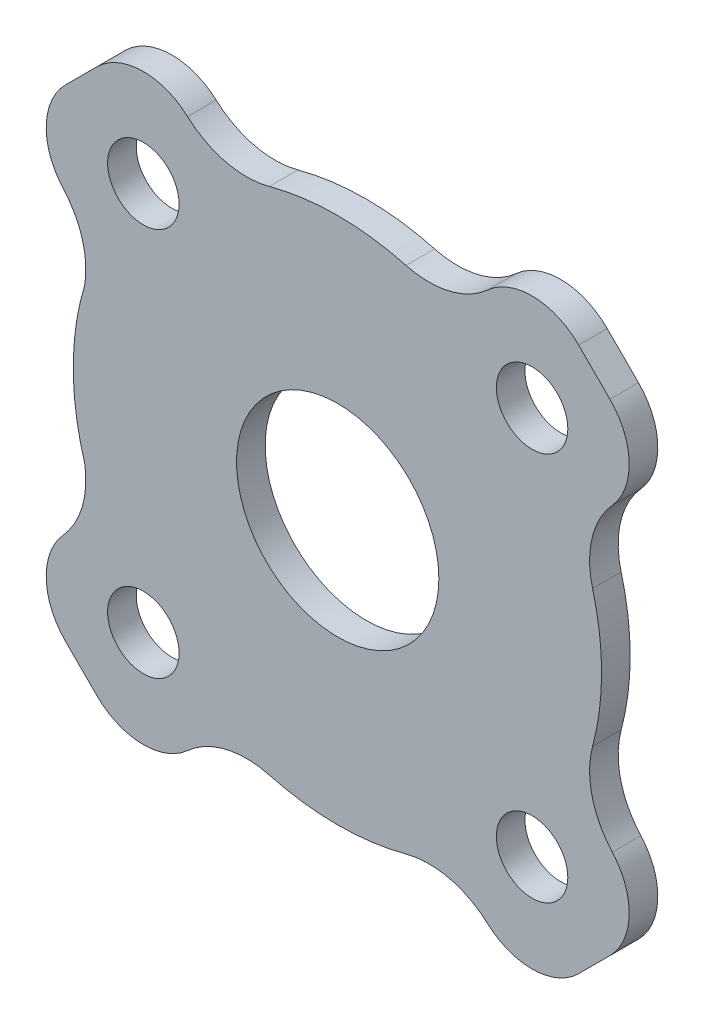
ISO-10303-21;
HEADER;
FILE_DESCRIPTION(('STEP AP214'),'2;1');
FILE_NAME('part.step','',(''),(''),'','','');
FILE_SCHEMA(('AUTOMOTIVE_DESIGN { 1 0 10303 214 1 1 1 1 }'));
ENDSEC;
DATA;
#1=APPLICATION_CONTEXT('core data for automotive mechanical design processes');
#2=APPLICATION_PROTOCOL_DEFINITION('international standard','automotive_design',2000,#1);
#3=PRODUCT_CONTEXT('',#1,'mechanical');
#4=PRODUCT('Part','Part','',(#3));
#5=PRODUCT_RELATED_PRODUCT_CATEGORY('part','',(#4));
#6=PRODUCT_DEFINITION_FORMATION('','',#4);
#7=PRODUCT_DEFINITION_CONTEXT('part definition',#1,'design');
#8=PRODUCT_DEFINITION('design','',#6,#7);
#9=PRODUCT_DEFINITION_SHAPE('','',#8);
#10=(LENGTH_UNIT() NAMED_UNIT(*) SI_UNIT(.MILLI.,.METRE.));
#11=(NAMED_UNIT(*) PLANE_ANGLE_UNIT() SI_UNIT($,.RADIAN.));
#12=(NAMED_UNIT(*) SI_UNIT($,.STERADIAN.) SOLID_ANGLE_UNIT());
#13=UNCERTAINTY_MEASURE_WITH_UNIT(LENGTH_MEASURE(1.E-05),#10,'distance_accuracy_value','');
#14=(GEOMETRIC_REPRESENTATION_CONTEXT(3) GLOBAL_UNCERTAINTY_ASSIGNED_CONTEXT((#13)) GLOBAL_UNIT_ASSIGNED_CONTEXT((#10,
#11,#12)) REPRESENTATION_CONTEXT('',''));
#15=CARTESIAN_POINT('',(0.,0.,0.));
#16=DIRECTION('',(0.,0.,1.));
#17=DIRECTION('',(1.,0.,0.));
#18=AXIS2_PLACEMENT_3D('',#15,#16,#17);
#19=CARTESIAN_POINT('',(22.4859040141901,5.93996738273083,1.3));
#20=DIRECTION('',(0.,0.,-1.));
#21=DIRECTION('',(-1.,0.,0.));
#22=AXIS2_PLACEMENT_3D('',#19,#20,#21);
#23=PLANE('',#22);
#24=CARTESIAN_POINT('',(22.4859040141901,5.93996738273083,1.3));
#25=DIRECTION('',(0.,0.,1.));
#26=DIRECTION('',(-1.,0.,0.));
#27=AXIS2_PLACEMENT_3D('',#24,#25,#26);
#28=CIRCLE('',#27,3.00000000000009);
#29=CARTESIAN_POINT('',(24.7133560858567,3.93037606397257,1.3));
#30=VERTEX_POINT('',#29);
#31=CARTESIAN_POINT('',(24.6072243577499,8.06128772629043,1.3));
#32=VERTEX_POINT('',#31);
#33=EDGE_CURVE('E291',#30,#32,#28,.T.);
#34=ORIENTED_EDGE('',*,*,#33,.T.);
#35=DIRECTION('',(-0.707106781186544,0.707106781186551,0.));
#36=VECTOR('',#35,1.);
#37=CARTESIAN_POINT('',(23.1874134986823,9.48109858535804,1.3));
#38=LINE('',#37,#36);
#39=CARTESIAN_POINT('',(23.1874134986823,9.48109858535804,1.3));
#40=VERTEX_POINT('',#39);
#41=EDGE_CURVE('E159',#32,#40,#38,.T.);
#42=ORIENTED_EDGE('',*,*,#41,.T.);
#43=CARTESIAN_POINT('',(21.0660931551227,7.35977824179842,1.3));
#44=DIRECTION('',(0.,0.,1.));
#45=DIRECTION('',(-1.,0.,0.));
#46=AXIS2_PLACEMENT_3D('',#43,#44,#45);
#47=CIRCLE('',#46,3.);
#48=CARTESIAN_POINT('',(19.0565018363651,9.58723031346558,1.3));
#49=VERTEX_POINT('',#48);
#50=EDGE_CURVE('E354',#40,#49,#47,.T.);
#51=ORIENTED_EDGE('',*,*,#50,.T.);
#52=CARTESIAN_POINT('',(16.3770467446884,12.5571664090219,1.3));
#53=DIRECTION('',(0.,0.,-1.));
#54=DIRECTION('',(-1.,0.,0.));
#55=AXIS2_PLACEMENT_3D('',#52,#53,#54);
#56=CIRCLE('',#55,4.0000000000001);
#57=CARTESIAN_POINT('',(15.3402993181757,8.69385762332792,1.3));
#58=VERTEX_POINT('',#57);
#59=EDGE_CURVE('E373',#49,#58,#56,.T.);
#60=ORIENTED_EDGE('',*,*,#59,.T.);
#61=CARTESIAN_POINT('',(12.2300570386382,-2.89606873375369,1.3));
#62=DIRECTION('',(0.,0.,1.));
#63=DIRECTION('',(-1.,0.,0.));
#64=AXIS2_PLACEMENT_3D('',#61,#62,#63);
#65=CIRCLE('',#64,11.9999999999999);
#66=CARTESIAN_POINT('',(9.11981475909832,8.69385762332731,1.3));
#67=VERTEX_POINT('',#66);
#68=EDGE_CURVE('E370',#58,#67,#65,.T.);
#69=ORIENTED_EDGE('',*,*,#68,.T.);
#70=CARTESIAN_POINT('',(8.08306733258646,12.5571664090156,1.3));
#71=DIRECTION('',(0.,0.,-1.));
#72=DIRECTION('',(-1.,0.,0.));
#73=AXIS2_PLACEMENT_3D('',#70,#71,#72);
#74=CIRCLE('',#73,3.9999999999944);
#75=CARTESIAN_POINT('',(5.40361224091216,9.58723031346477,1.3));
#76=VERTEX_POINT('',#75);
#77=EDGE_CURVE('E372',#67,#76,#74,.T.);
#78=ORIENTED_EDGE('',*,*,#77,.T.);
#79=CARTESIAN_POINT('',(3.39402092215368,7.35977824179857,1.3));
#80=DIRECTION('',(0.,0.,1.));
#81=DIRECTION('',(-1.,0.,0.));
#82=AXIS2_PLACEMENT_3D('',#79,#80,#81);
#83=CIRCLE('',#82,2.99999999999997);
#84=CARTESIAN_POINT('',(1.27270057859407,9.48109858535821,1.3));
#85=VERTEX_POINT('',#84);
#86=EDGE_CURVE('E375',#76,#85,#83,.T.);
#87=ORIENTED_EDGE('',*,*,#86,.T.);
#88=DIRECTION('',(-0.707106781186551,-0.707106781186545,0.));
#89=VECTOR('',#88,1.);
#90=CARTESIAN_POINT('',(-0.147110280473534,8.06128772629065,1.3));
#91=LINE('',#90,#89);
#92=CARTESIAN_POINT('',(-0.147110280473534,8.06128772629065,1.3));
#93=VERTEX_POINT('',#92);
#94=EDGE_CURVE('E381',#85,#93,#91,.T.);
#95=ORIENTED_EDGE('',*,*,#94,.T.);
#96=CARTESIAN_POINT('',(1.97421006308601,5.93996738273091,1.3));
#97=DIRECTION('',(0.,0.,1.));
#98=DIRECTION('',(-1.,0.,0.));
#99=AXIS2_PLACEMENT_3D('',#96,#97,#98);
#100=CIRCLE('',#99,2.99999999999998);
#101=CARTESIAN_POINT('',(-0.253242008581175,3.93037606397341,1.3));
#102=VERTEX_POINT('',#101);
#103=EDGE_CURVE('E383',#93,#102,#100,.T.);
#104=ORIENTED_EDGE('',*,*,#103,.T.);
#105=CARTESIAN_POINT('',(-3.22317810413745,1.25092097229657,1.3));
#106=DIRECTION('',(0.,0.,-1.));
#107=DIRECTION('',(-1.,0.,0.));
#108=AXIS2_PLACEMENT_3D('',#105,#106,#107);
#109=CIRCLE('',#108,4.00000000000014);
#110=CARTESIAN_POINT('',(0.724150653423294,0.603931266246299,1.3));
#111=VERTEX_POINT('',#110);
#112=EDGE_CURVE('E385',#102,#111,#109,.T.);
#113=ORIENTED_EDGE('',*,*,#112,.T.);
#114=CARTESIAN_POINT('',(12.2300570386382,-2.89606873375369,1.3));
#115=DIRECTION('',(0.,0.,1.));
#116=DIRECTION('',(-1.,0.,0.));
#117=AXIS2_PLACEMENT_3D('',#114,#115,#116);
#118=CIRCLE('',#117,12.0264658875885);
#119=CARTESIAN_POINT('',(0.724150653423296,-6.39606873375369,1.3));
#120=VERTEX_POINT('',#119);
#121=EDGE_CURVE('E387',#111,#120,#118,.T.);
#122=ORIENTED_EDGE('',*,*,#121,.T.);
#123=CARTESIAN_POINT('',(-3.22317810413745,-7.04305843980397,1.3));
#124=DIRECTION('',(0.,0.,-1.));
#125=DIRECTION('',(1.,0.,0.));
#126=AXIS2_PLACEMENT_3D('',#123,#124,#125);
#127=CIRCLE('',#126,4.00000000000013);
#128=CARTESIAN_POINT('',(-0.253242008581168,-9.72251353148081,1.3));
#129=VERTEX_POINT('',#128);
#130=EDGE_CURVE('E389',#120,#129,#127,.T.);
#131=ORIENTED_EDGE('',*,*,#130,.T.);
#132=CARTESIAN_POINT('',(1.97421006308601,-11.7321048502383,1.3));
#133=DIRECTION('',(0.,0.,1.));
#134=DIRECTION('',(1.,0.,0.));
#135=AXIS2_PLACEMENT_3D('',#132,#133,#134);
#136=CIRCLE('',#135,2.99999999999999);
#137=CARTESIAN_POINT('',(-0.147110280473527,-13.853425193798,1.3));
#138=VERTEX_POINT('',#137);
#139=EDGE_CURVE('E391',#129,#138,#136,.T.);
#140=ORIENTED_EDGE('',*,*,#139,.T.);
#141=DIRECTION('',(0.707106781186561,-0.707106781186534,0.));
#142=VECTOR('',#141,1.);
#143=CARTESIAN_POINT('',(-0.14711028047353,-13.853425193798,1.3));
#144=LINE('',#143,#142);
#145=CARTESIAN_POINT('',(1.27270057859408,-15.2732360528656,1.3));
#146=VERTEX_POINT('',#145);
#147=EDGE_CURVE('E393',#138,#146,#144,.T.);
#148=ORIENTED_EDGE('',*,*,#147,.T.);
#149=CARTESIAN_POINT('',(3.39402092215368,-13.151915709306,1.3));
#150=DIRECTION('',(0.,0.,1.));
#151=DIRECTION('',(1.,0.,0.));
#152=AXIS2_PLACEMENT_3D('',#149,#150,#151);
#153=CIRCLE('',#152,2.99999999999995);
#154=CARTESIAN_POINT('',(5.40361224091218,-15.3793677809722,1.3));
#155=VERTEX_POINT('',#154);
#156=EDGE_CURVE('E395',#146,#155,#153,.T.);
#157=ORIENTED_EDGE('',*,*,#156,.T.);
#158=CARTESIAN_POINT('',(8.08306733258647,-18.349303876523,1.3));
#159=DIRECTION('',(0.,0.,-1.));
#160=DIRECTION('',(1.,0.,0.));
#161=AXIS2_PLACEMENT_3D('',#158,#159,#160);
#162=CIRCLE('',#161,3.99999999999442);
#163=CARTESIAN_POINT('',(9.11981475909831,-14.4859950908347,1.3));
#164=VERTEX_POINT('',#163);
#165=EDGE_CURVE('E397',#155,#164,#162,.T.);
#166=ORIENTED_EDGE('',*,*,#165,.T.);
#167=CARTESIAN_POINT('',(12.2300570386382,-2.89606873375369,1.3));
#168=DIRECTION('',(0.,0.,1.));
#169=DIRECTION('',(1.,0.,0.));
#170=AXIS2_PLACEMENT_3D('',#167,#168,#169);
#171=CIRCLE('',#170,11.9999999999999);
#172=CARTESIAN_POINT('',(15.3402993181757,-14.4859950908353,1.3));
#173=VERTEX_POINT('',#172);
#174=EDGE_CURVE('E399',#164,#173,#171,.T.);
#175=ORIENTED_EDGE('',*,*,#174,.T.);
#176=CARTESIAN_POINT('',(16.3770467446884,-18.3493038765293,1.3));
#177=DIRECTION('',(0.,0.,-1.));
#178=DIRECTION('',(1.,0.,0.));
#179=AXIS2_PLACEMENT_3D('',#176,#177,#178);
#180=CIRCLE('',#179,4.0000000000001);
#181=CARTESIAN_POINT('',(19.0565018363651,-15.379367780973,1.3));
#182=VERTEX_POINT('',#181);
#183=EDGE_CURVE('E401',#173,#182,#180,.T.);
#184=ORIENTED_EDGE('',*,*,#183,.T.);
#185=CARTESIAN_POINT('',(21.0660931551227,-13.1519157093058,1.3));
#186=DIRECTION('',(0.,0.,1.));
#187=DIRECTION('',(1.,0.,0.));
#188=AXIS2_PLACEMENT_3D('',#185,#186,#187);
#189=CIRCLE('',#188,3.);
#190=CARTESIAN_POINT('',(23.1874134986823,-15.2732360528654,1.3));
#191=VERTEX_POINT('',#190);
#192=EDGE_CURVE('E403',#182,#191,#189,.T.);
#193=ORIENTED_EDGE('',*,*,#192,.T.);
#194=DIRECTION('',(0.707106781186551,0.707106781186544,0.));
#195=VECTOR('',#194,1.);
#196=CARTESIAN_POINT('',(23.1874134986823,-15.2732360528654,1.3));
#197=LINE('',#196,#195);
#198=CARTESIAN_POINT('',(24.6072243577499,-13.8534251937978,1.3));
#199=VERTEX_POINT('',#198);
#200=EDGE_CURVE('E405',#191,#199,#197,.T.);
#201=ORIENTED_EDGE('',*,*,#200,.T.);
#202=CARTESIAN_POINT('',(22.4859040141903,-11.7321048502382,1.3));
#203=DIRECTION('',(0.,0.,1.));
#204=DIRECTION('',(1.,0.,0.));
#205=AXIS2_PLACEMENT_3D('',#202,#203,#204);
#206=CIRCLE('',#205,3.00000000000001);
#207=CARTESIAN_POINT('',(24.7133560858568,-9.7225135314799,1.3));
#208=VERTEX_POINT('',#207);
#209=EDGE_CURVE('E226',#199,#208,#206,.T.);
#210=ORIENTED_EDGE('',*,*,#209,.T.);
#211=CARTESIAN_POINT('',(27.6832921814075,-7.04305843980542,1.3));
#212=DIRECTION('',(0.,0.,-1.));
#213=DIRECTION('',(1.,0.,0.));
#214=AXIS2_PLACEMENT_3D('',#211,#212,#213);
#215=CIRCLE('',#214,3.99999999999451);
#216=CARTESIAN_POINT('',(23.8199833957192,-6.00631101329336,1.3));
#217=VERTEX_POINT('',#216);
#218=EDGE_CURVE('E220',#208,#217,#215,.T.);
#219=ORIENTED_EDGE('',*,*,#218,.T.);
#220=CARTESIAN_POINT('',(12.2300570386382,-2.89606873375369,1.3));
#221=DIRECTION('',(0.,0.,1.));
#222=DIRECTION('',(1.,0.,0.));
#223=AXIS2_PLACEMENT_3D('',#220,#221,#222);
#224=CIRCLE('',#223,11.9999999999998);
#225=CARTESIAN_POINT('',(23.8199833957197,0.214173545783891,1.3));
#226=VERTEX_POINT('',#225);
#227=EDGE_CURVE('E224',#217,#226,#224,.T.);
#228=ORIENTED_EDGE('',*,*,#227,.T.);
#229=CARTESIAN_POINT('',(27.6832921814136,1.25092097229653,1.3));
#230=DIRECTION('',(0.,0.,-1.));
#231=DIRECTION('',(-1.,0.,0.));
#232=AXIS2_PLACEMENT_3D('',#229,#230,#231);
#233=CIRCLE('',#232,4.00000000000004);
#234=EDGE_CURVE('E68',#226,#30,#233,.T.);
#235=ORIENTED_EDGE('',*,*,#234,.T.);
#236=EDGE_LOOP('',(#34,#42,#51,#60,#69,#78,#87,#95,#104,#113,#122,#131,#140,#148,#157,#166,#175,
#184,#193,#201,#210,#219,#228,#235));
#237=FACE_BOUND('',#236,.T.);
#238=CARTESIAN_POINT('',(21.06889180347,5.9427660310782,1.3));
#239=DIRECTION('',(0.,0.,1.));
#240=DIRECTION('',(1.,0.,0.));
#241=AXIS2_PLACEMENT_3D('',#238,#239,#240);
#242=CIRCLE('',#241,1.625);
#243=CARTESIAN_POINT('',(22.69389180347,5.9427660310782,1.3));
#244=VERTEX_POINT('',#243);
#245=EDGE_CURVE('E248',#244,#244,#242,.T.);
#246=ORIENTED_EDGE('',*,*,#245,.F.);
#247=EDGE_LOOP('',(#246));
#248=FACE_BOUND('',#247,.T.);
#249=CARTESIAN_POINT('',(21.0688918034701,-11.7349034985855,1.3));
#250=DIRECTION('',(0.,0.,1.));
#251=DIRECTION('',(1.,0.,0.));
#252=AXIS2_PLACEMENT_3D('',#249,#250,#251);
#253=CIRCLE('',#252,1.625);
#254=CARTESIAN_POINT('',(22.6938918034701,-11.7349034985855,1.3));
#255=VERTEX_POINT('',#254);
#256=EDGE_CURVE('E479',#255,#255,#253,.T.);
#257=ORIENTED_EDGE('',*,*,#256,.F.);
#258=EDGE_LOOP('',(#257));
#259=FACE_BOUND('',#258,.T.);
#260=CARTESIAN_POINT('',(3.39122227380639,-11.7349034985856,1.3));
#261=DIRECTION('',(0.,0.,1.));
#262=DIRECTION('',(1.,0.,0.));
#263=AXIS2_PLACEMENT_3D('',#260,#261,#262);
#264=CIRCLE('',#263,1.625);
#265=CARTESIAN_POINT('',(5.0162222738064,-11.7349034985856,1.3));
#266=VERTEX_POINT('',#265);
#267=EDGE_CURVE('E473',#266,#266,#264,.T.);
#268=ORIENTED_EDGE('',*,*,#267,.F.);
#269=EDGE_LOOP('',(#268));
#270=FACE_BOUND('',#269,.T.);
#271=CARTESIAN_POINT('',(12.2300570386382,-2.89606873375369,1.3));
#272=DIRECTION('',(0.,0.,1.));
#273=DIRECTION('',(1.,0.,0.));
#274=AXIS2_PLACEMENT_3D('',#271,#272,#273);
#275=CIRCLE('',#274,4.6);
#276=CARTESIAN_POINT('',(16.8300570386382,-2.89606873375369,1.3));
#277=VERTEX_POINT('',#276);
#278=EDGE_CURVE('E467',#277,#277,#275,.T.);
#279=ORIENTED_EDGE('',*,*,#278,.F.);
#280=EDGE_LOOP('',(#279));
#281=FACE_BOUND('',#280,.T.);
#282=CARTESIAN_POINT('',(3.3912222738063,5.94276603107811,1.3));
#283=DIRECTION('',(0.,0.,1.));
#284=DIRECTION('',(1.,0.,0.));
#285=AXIS2_PLACEMENT_3D('',#282,#283,#284);
#286=CIRCLE('',#285,1.625);
#287=CARTESIAN_POINT('',(5.0162222738063,5.94276603107811,1.3));
#288=VERTEX_POINT('',#287);
#289=EDGE_CURVE('E458',#288,#288,#286,.T.);
#290=ORIENTED_EDGE('',*,*,#289,.F.);
#291=EDGE_LOOP('',(#290));
#292=FACE_BOUND('',#291,.T.);
#293=ADVANCED_FACE('F51',(#237,#248,#259,#270,#281,#292),#23,.F.);
#294=CARTESIAN_POINT('',(22.4859040141901,5.93996738273083,0.));
#295=DIRECTION('',(0.,0.,-1.));
#296=DIRECTION('',(-1.,0.,0.));
#297=AXIS2_PLACEMENT_3D('',#294,#295,#296);
#298=PLANE('',#297);
#299=CARTESIAN_POINT('',(12.2300570386382,-2.89606873375369,0.));
#300=DIRECTION('',(0.,0.,1.));
#301=DIRECTION('',(1.,0.,0.));
#302=AXIS2_PLACEMENT_3D('',#299,#300,#301);
#303=CIRCLE('',#302,4.6);
#304=CARTESIAN_POINT('',(16.8300570386382,-2.89606873375369,0.));
#305=VERTEX_POINT('',#304);
#306=EDGE_CURVE('E464',#305,#305,#303,.T.);
#307=ORIENTED_EDGE('',*,*,#306,.T.);
#308=EDGE_LOOP('',(#307));
#309=FACE_BOUND('',#308,.T.);
#310=CARTESIAN_POINT('',(21.0688918034701,-11.7349034985855,0.));
#311=DIRECTION('',(0.,0.,1.));
#312=DIRECTION('',(1.,0.,0.));
#313=AXIS2_PLACEMENT_3D('',#310,#311,#312);
#314=CIRCLE('',#313,1.625);
#315=CARTESIAN_POINT('',(22.6938918034701,-11.7349034985855,0.));
#316=VERTEX_POINT('',#315);
#317=EDGE_CURVE('E476',#316,#316,#314,.T.);
#318=ORIENTED_EDGE('',*,*,#317,.T.);
#319=EDGE_LOOP('',(#318));
#320=FACE_BOUND('',#319,.T.);
#321=CARTESIAN_POINT('',(22.4859040141901,5.93996738273083,0.));
#322=DIRECTION('',(0.,0.,1.));
#323=DIRECTION('',(-1.,0.,0.));
#324=AXIS2_PLACEMENT_3D('',#321,#322,#323);
#325=CIRCLE('',#324,3.00000000000009);
#326=CARTESIAN_POINT('',(24.7133560858567,3.93037606397257,0.));
#327=VERTEX_POINT('',#326);
#328=CARTESIAN_POINT('',(24.6072243577499,8.06128772629043,0.));
#329=VERTEX_POINT('',#328);
#330=EDGE_CURVE('E244',#327,#329,#325,.T.);
#331=ORIENTED_EDGE('',*,*,#330,.F.);
#332=CARTESIAN_POINT('',(27.6832921814136,1.25092097229653,0.));
#333=DIRECTION('',(0.,0.,-1.));
#334=DIRECTION('',(-1.,0.,0.));
#335=AXIS2_PLACEMENT_3D('',#332,#333,#334);
#336=CIRCLE('',#335,4.00000000000004);
#337=CARTESIAN_POINT('',(23.8199833957197,0.214173545783891,0.));
#338=VERTEX_POINT('',#337);
#339=EDGE_CURVE('E151',#338,#327,#336,.T.);
#340=ORIENTED_EDGE('',*,*,#339,.F.);
#341=CARTESIAN_POINT('',(12.2300570386382,-2.89606873375369,0.));
#342=DIRECTION('',(0.,0.,1.));
#343=DIRECTION('',(1.,0.,0.));
#344=AXIS2_PLACEMENT_3D('',#341,#342,#343);
#345=CIRCLE('',#344,11.9999999999998);
#346=CARTESIAN_POINT('',(23.8199833957192,-6.00631101329336,0.));
#347=VERTEX_POINT('',#346);
#348=EDGE_CURVE('E145',#347,#338,#345,.T.);
#349=ORIENTED_EDGE('',*,*,#348,.F.);
#350=CARTESIAN_POINT('',(27.6832921814075,-7.04305843980542,0.));
#351=DIRECTION('',(0.,0.,-1.));
#352=DIRECTION('',(1.,0.,0.));
#353=AXIS2_PLACEMENT_3D('',#350,#351,#352);
#354=CIRCLE('',#353,3.99999999999451);
#355=CARTESIAN_POINT('',(24.7133560858568,-9.7225135314799,0.));
#356=VERTEX_POINT('',#355);
#357=EDGE_CURVE('E234',#356,#347,#354,.T.);
#358=ORIENTED_EDGE('',*,*,#357,.F.);
#359=CARTESIAN_POINT('',(22.4859040141903,-11.7321048502382,0.));
#360=DIRECTION('',(0.,0.,1.));
#361=DIRECTION('',(1.,0.,0.));
#362=AXIS2_PLACEMENT_3D('',#359,#360,#361);
#363=CIRCLE('',#362,3.00000000000001);
#364=CARTESIAN_POINT('',(24.6072243577499,-13.8534251937978,0.));
#365=VERTEX_POINT('',#364);
#366=EDGE_CURVE('E286',#365,#356,#363,.T.);
#367=ORIENTED_EDGE('',*,*,#366,.F.);
#368=DIRECTION('',(0.707106781186551,0.707106781186544,0.));
#369=VECTOR('',#368,1.);
#370=CARTESIAN_POINT('',(23.1874134986823,-15.2732360528654,0.));
#371=LINE('',#370,#369);
#372=CARTESIAN_POINT('',(23.1874134986823,-15.2732360528654,0.));
#373=VERTEX_POINT('',#372);
#374=EDGE_CURVE('E284',#373,#365,#371,.T.);
#375=ORIENTED_EDGE('',*,*,#374,.F.);
#376=CARTESIAN_POINT('',(21.0660931551227,-13.1519157093058,0.));
#377=DIRECTION('',(0.,0.,1.));
#378=DIRECTION('',(1.,0.,0.));
#379=AXIS2_PLACEMENT_3D('',#376,#377,#378);
#380=CIRCLE('',#379,3.);
#381=CARTESIAN_POINT('',(19.0565018363651,-15.379367780973,0.));
#382=VERTEX_POINT('',#381);
#383=EDGE_CURVE('E282',#382,#373,#380,.T.);
#384=ORIENTED_EDGE('',*,*,#383,.F.);
#385=CARTESIAN_POINT('',(16.3770467446884,-18.3493038765293,0.));
#386=DIRECTION('',(0.,0.,-1.));
#387=DIRECTION('',(1.,0.,0.));
#388=AXIS2_PLACEMENT_3D('',#385,#386,#387);
#389=CIRCLE('',#388,4.0000000000001);
#390=CARTESIAN_POINT('',(15.3402993181757,-14.4859950908353,0.));
#391=VERTEX_POINT('',#390);
#392=EDGE_CURVE('E280',#391,#382,#389,.T.);
#393=ORIENTED_EDGE('',*,*,#392,.F.);
#394=CARTESIAN_POINT('',(12.2300570386382,-2.89606873375369,0.));
#395=DIRECTION('',(0.,0.,1.));
#396=DIRECTION('',(1.,0.,0.));
#397=AXIS2_PLACEMENT_3D('',#394,#395,#396);
#398=CIRCLE('',#397,11.9999999999999);
#399=CARTESIAN_POINT('',(9.11981475909831,-14.4859950908347,0.));
#400=VERTEX_POINT('',#399);
#401=EDGE_CURVE('E278',#400,#391,#398,.T.);
#402=ORIENTED_EDGE('',*,*,#401,.F.);
#403=CARTESIAN_POINT('',(8.08306733258647,-18.349303876523,0.));
#404=DIRECTION('',(0.,0.,-1.));
#405=DIRECTION('',(1.,0.,0.));
#406=AXIS2_PLACEMENT_3D('',#403,#404,#405);
#407=CIRCLE('',#406,3.99999999999442);
#408=CARTESIAN_POINT('',(5.40361224091218,-15.3793677809722,0.));
#409=VERTEX_POINT('',#408);
#410=EDGE_CURVE('E276',#409,#400,#407,.T.);
#411=ORIENTED_EDGE('',*,*,#410,.F.);
#412=CARTESIAN_POINT('',(3.39402092215368,-13.151915709306,0.));
#413=DIRECTION('',(0.,0.,1.));
#414=DIRECTION('',(1.,0.,0.));
#415=AXIS2_PLACEMENT_3D('',#412,#413,#414);
#416=CIRCLE('',#415,2.99999999999995);
#417=CARTESIAN_POINT('',(1.27270057859408,-15.2732360528656,0.));
#418=VERTEX_POINT('',#417);
#419=EDGE_CURVE('E274',#418,#409,#416,.T.);
#420=ORIENTED_EDGE('',*,*,#419,.F.);
#421=DIRECTION('',(0.707106781186561,-0.707106781186534,0.));
#422=VECTOR('',#421,1.);
#423=CARTESIAN_POINT('',(-0.14711028047353,-13.853425193798,0.));
#424=LINE('',#423,#422);
#425=CARTESIAN_POINT('',(-0.147110280473527,-13.853425193798,0.));
#426=VERTEX_POINT('',#425);
#427=EDGE_CURVE('E272',#426,#418,#424,.T.);
#428=ORIENTED_EDGE('',*,*,#427,.F.);
#429=CARTESIAN_POINT('',(1.97421006308601,-11.7321048502383,0.));
#430=DIRECTION('',(0.,0.,1.));
#431=DIRECTION('',(1.,0.,0.));
#432=AXIS2_PLACEMENT_3D('',#429,#430,#431);
#433=CIRCLE('',#432,2.99999999999999);
#434=CARTESIAN_POINT('',(-0.253242008581168,-9.72251353148081,0.));
#435=VERTEX_POINT('',#434);
#436=EDGE_CURVE('E270',#435,#426,#433,.T.);
#437=ORIENTED_EDGE('',*,*,#436,.F.);
#438=CARTESIAN_POINT('',(-3.22317810413745,-7.04305843980397,0.));
#439=DIRECTION('',(0.,0.,-1.));
#440=DIRECTION('',(1.,0.,0.));
#441=AXIS2_PLACEMENT_3D('',#438,#439,#440);
#442=CIRCLE('',#441,4.00000000000013);
#443=CARTESIAN_POINT('',(0.724150653423296,-6.39606873375369,0.));
#444=VERTEX_POINT('',#443);
#445=EDGE_CURVE('E268',#444,#435,#442,.T.);
#446=ORIENTED_EDGE('',*,*,#445,.F.);
#447=CARTESIAN_POINT('',(12.2300570386382,-2.89606873375369,0.));
#448=DIRECTION('',(0.,0.,1.));
#449=DIRECTION('',(-1.,0.,0.));
#450=AXIS2_PLACEMENT_3D('',#447,#448,#449);
#451=CIRCLE('',#450,12.0264658875885);
#452=CARTESIAN_POINT('',(0.724150653423294,0.603931266246299,0.));
#453=VERTEX_POINT('',#452);
#454=EDGE_CURVE('E266',#453,#444,#451,.T.);
#455=ORIENTED_EDGE('',*,*,#454,.F.);
#456=CARTESIAN_POINT('',(-3.22317810413745,1.25092097229657,0.));
#457=DIRECTION('',(0.,0.,-1.));
#458=DIRECTION('',(-1.,0.,0.));
#459=AXIS2_PLACEMENT_3D('',#456,#457,#458);
#460=CIRCLE('',#459,4.00000000000014);
#461=CARTESIAN_POINT('',(-0.253242008581175,3.93037606397341,0.));
#462=VERTEX_POINT('',#461);
#463=EDGE_CURVE('E264',#462,#453,#460,.T.);
#464=ORIENTED_EDGE('',*,*,#463,.F.);
#465=CARTESIAN_POINT('',(1.97421006308601,5.93996738273091,0.));
#466=DIRECTION('',(0.,0.,1.));
#467=DIRECTION('',(-1.,0.,0.));
#468=AXIS2_PLACEMENT_3D('',#465,#466,#467);
#469=CIRCLE('',#468,2.99999999999998);
#470=CARTESIAN_POINT('',(-0.147110280473534,8.06128772629065,0.));
#471=VERTEX_POINT('',#470);
#472=EDGE_CURVE('E262',#471,#462,#469,.T.);
#473=ORIENTED_EDGE('',*,*,#472,.F.);
#474=DIRECTION('',(-0.707106781186551,-0.707106781186545,0.));
#475=VECTOR('',#474,1.);
#476=CARTESIAN_POINT('',(-0.147110280473534,8.06128772629065,0.));
#477=LINE('',#476,#475);
#478=CARTESIAN_POINT('',(1.27270057859407,9.48109858535821,0.));
#479=VERTEX_POINT('',#478);
#480=EDGE_CURVE('E260',#479,#471,#477,.T.);
#481=ORIENTED_EDGE('',*,*,#480,.F.);
#482=CARTESIAN_POINT('',(3.39402092215368,7.35977824179857,0.));
#483=DIRECTION('',(0.,0.,1.));
#484=DIRECTION('',(-1.,0.,0.));
#485=AXIS2_PLACEMENT_3D('',#482,#483,#484);
#486=CIRCLE('',#485,2.99999999999997);
#487=CARTESIAN_POINT('',(5.40361224091216,9.58723031346477,0.));
#488=VERTEX_POINT('',#487);
#489=EDGE_CURVE('E258',#488,#479,#486,.T.);
#490=ORIENTED_EDGE('',*,*,#489,.F.);
#491=CARTESIAN_POINT('',(8.08306733258646,12.5571664090156,0.));
#492=DIRECTION('',(0.,0.,-1.));
#493=DIRECTION('',(-1.,0.,0.));
#494=AXIS2_PLACEMENT_3D('',#491,#492,#493);
#495=CIRCLE('',#494,3.9999999999944);
#496=CARTESIAN_POINT('',(9.11981475909832,8.69385762332731,0.));
#497=VERTEX_POINT('',#496);
#498=EDGE_CURVE('E256',#497,#488,#495,.T.);
#499=ORIENTED_EDGE('',*,*,#498,.F.);
#500=CARTESIAN_POINT('',(12.2300570386382,-2.89606873375369,0.));
#501=DIRECTION('',(0.,0.,1.));
#502=DIRECTION('',(-1.,0.,0.));
#503=AXIS2_PLACEMENT_3D('',#500,#501,#502);
#504=CIRCLE('',#503,11.9999999999999);
#505=CARTESIAN_POINT('',(15.3402993181757,8.69385762332792,0.));
#506=VERTEX_POINT('',#505);
#507=EDGE_CURVE('E254',#506,#497,#504,.T.);
#508=ORIENTED_EDGE('',*,*,#507,.F.);
#509=CARTESIAN_POINT('',(16.3770467446884,12.5571664090219,0.));
#510=DIRECTION('',(0.,0.,-1.));
#511=DIRECTION('',(-1.,0.,0.));
#512=AXIS2_PLACEMENT_3D('',#509,#510,#511);
#513=CIRCLE('',#512,4.0000000000001);
#514=CARTESIAN_POINT('',(19.0565018363651,9.58723031346558,0.));
#515=VERTEX_POINT('',#514);
#516=EDGE_CURVE('E252',#515,#506,#513,.T.);
#517=ORIENTED_EDGE('',*,*,#516,.F.);
#518=CARTESIAN_POINT('',(21.0660931551227,7.35977824179842,0.));
#519=DIRECTION('',(0.,0.,1.));
#520=DIRECTION('',(-1.,0.,0.));
#521=AXIS2_PLACEMENT_3D('',#518,#519,#520);
#522=CIRCLE('',#521,3.);
#523=CARTESIAN_POINT('',(23.1874134986823,9.48109858535804,0.));
#524=VERTEX_POINT('',#523);
#525=EDGE_CURVE('E250',#524,#515,#522,.T.);
#526=ORIENTED_EDGE('',*,*,#525,.F.);
#527=DIRECTION('',(-0.707106781186544,0.707106781186551,0.));
#528=VECTOR('',#527,1.);
#529=CARTESIAN_POINT('',(23.1874134986823,9.48109858535804,0.));
#530=LINE('',#529,#528);
#531=EDGE_CURVE('E247',#329,#524,#530,.T.);
#532=ORIENTED_EDGE('',*,*,#531,.F.);
#533=EDGE_LOOP('',(#331,#340,#349,#358,#367,#375,#384,#393,#402,#411,#420,#428,#437,#446,#455,
#464,#473,#481,#490,#499,#508,#517,#526,#532));
#534=FACE_BOUND('',#533,.T.);
#535=CARTESIAN_POINT('',(21.06889180347,5.9427660310782,0.));
#536=DIRECTION('',(0.,0.,1.));
#537=DIRECTION('',(1.,0.,0.));
#538=AXIS2_PLACEMENT_3D('',#535,#536,#537);
#539=CIRCLE('',#538,1.625);
#540=CARTESIAN_POINT('',(22.69389180347,5.9427660310782,0.));
#541=VERTEX_POINT('',#540);
#542=EDGE_CURVE('E482',#541,#541,#539,.T.);
#543=ORIENTED_EDGE('',*,*,#542,.T.);
#544=EDGE_LOOP('',(#543));
#545=FACE_BOUND('',#544,.T.);
#546=CARTESIAN_POINT('',(3.39122227380639,-11.7349034985856,0.));
#547=DIRECTION('',(0.,0.,1.));
#548=DIRECTION('',(1.,0.,0.));
#549=AXIS2_PLACEMENT_3D('',#546,#547,#548);
#550=CIRCLE('',#549,1.625);
#551=CARTESIAN_POINT('',(5.0162222738064,-11.7349034985856,0.));
#552=VERTEX_POINT('',#551);
#553=EDGE_CURVE('E470',#552,#552,#550,.T.);
#554=ORIENTED_EDGE('',*,*,#553,.T.);
#555=EDGE_LOOP('',(#554));
#556=FACE_BOUND('',#555,.T.);
#557=CARTESIAN_POINT('',(3.3912222738063,5.94276603107811,0.));
#558=DIRECTION('',(0.,0.,1.));
#559=DIRECTION('',(1.,0.,0.));
#560=AXIS2_PLACEMENT_3D('',#557,#558,#559);
#561=CIRCLE('',#560,1.625);
#562=CARTESIAN_POINT('',(5.0162222738063,5.94276603107811,0.));
#563=VERTEX_POINT('',#562);
#564=EDGE_CURVE('E461',#563,#563,#561,.T.);
#565=ORIENTED_EDGE('',*,*,#564,.T.);
#566=EDGE_LOOP('',(#565));
#567=FACE_BOUND('',#566,.T.);
#568=ADVANCED_FACE('F358',(#309,#320,#534,#545,#556,#567),#298,.T.);
#569=CARTESIAN_POINT('',(22.4859040141901,5.93996738273083,1.3));
#570=DIRECTION('',(0.,0.,-1.));
#571=DIRECTION('',(-1.,0.,0.));
#572=AXIS2_PLACEMENT_3D('',#569,#570,#571);
#573=CYLINDRICAL_SURFACE('',#572,3.00000000000009);
#574=ORIENTED_EDGE('',*,*,#330,.T.);
#575=DIRECTION('',(0.,0.,-1.));
#576=VECTOR('',#575,1.);
#577=CARTESIAN_POINT('',(24.6072243577499,8.06128772629043,1.3));
#578=LINE('',#577,#576);
#579=EDGE_CURVE('E12',#32,#329,#578,.T.);
#580=ORIENTED_EDGE('',*,*,#579,.F.);
#581=ORIENTED_EDGE('',*,*,#33,.F.);
#582=DIRECTION('',(0.,0.,-1.));
#583=VECTOR('',#582,1.);
#584=CARTESIAN_POINT('',(24.7133560858567,3.93037606397257,1.3));
#585=LINE('',#584,#583);
#586=EDGE_CURVE('E240',#30,#327,#585,.T.);
#587=ORIENTED_EDGE('',*,*,#586,.T.);
#588=EDGE_LOOP('',(#574,#580,#581,#587));
#589=FACE_BOUND('',#588,.T.);
#590=ADVANCED_FACE('F53',(#589),#573,.T.);
#591=CARTESIAN_POINT('',(23.1874134986823,9.48109858535804,1.3));
#592=DIRECTION('',(-0.707106781186551,-0.707106781186544,0.));
#593=DIRECTION('',(0.707106781186544,-0.707106781186551,0.));
#594=AXIS2_PLACEMENT_3D('',#591,#592,#593);
#595=PLANE('',#594);
#596=ORIENTED_EDGE('',*,*,#531,.T.);
#597=DIRECTION('',(0.,0.,-1.));
#598=VECTOR('',#597,1.);
#599=CARTESIAN_POINT('',(23.1874134986823,9.48109858535804,1.3));
#600=LINE('',#599,#598);
#601=EDGE_CURVE('E60',#40,#524,#600,.T.);
#602=ORIENTED_EDGE('',*,*,#601,.F.);
#603=ORIENTED_EDGE('',*,*,#41,.F.);
#604=ORIENTED_EDGE('',*,*,#579,.T.);
#605=EDGE_LOOP('',(#596,#602,#603,#604));
#606=FACE_BOUND('',#605,.T.);
#607=ADVANCED_FACE('F728',(#606),#595,.F.);
#608=CARTESIAN_POINT('',(21.0660931551227,7.35977824179842,1.3));
#609=DIRECTION('',(0.,0.,-1.));
#610=DIRECTION('',(-1.,0.,0.));
#611=AXIS2_PLACEMENT_3D('',#608,#609,#610);
#612=CYLINDRICAL_SURFACE('',#611,3.);
#613=ORIENTED_EDGE('',*,*,#525,.T.);
#614=DIRECTION('',(0.,0.,-1.));
#615=VECTOR('',#614,1.);
#616=CARTESIAN_POINT('',(19.0565018363651,9.58723031346558,1.3));
#617=LINE('',#616,#615);
#618=EDGE_CURVE('E346',#49,#515,#617,.T.);
#619=ORIENTED_EDGE('',*,*,#618,.F.);
#620=ORIENTED_EDGE('',*,*,#50,.F.);
#621=ORIENTED_EDGE('',*,*,#601,.T.);
#622=EDGE_LOOP('',(#613,#619,#620,#621));
#623=FACE_BOUND('',#622,.T.);
#624=ADVANCED_FACE('F352',(#623),#612,.T.);
#625=CARTESIAN_POINT('',(16.3770467446884,12.5571664090219,1.3));
#626=DIRECTION('',(0.,0.,-1.));
#627=DIRECTION('',(-1.,0.,0.));
#628=AXIS2_PLACEMENT_3D('',#625,#626,#627);
#629=CYLINDRICAL_SURFACE('',#628,4.0000000000001);
#630=ORIENTED_EDGE('',*,*,#516,.T.);
#631=DIRECTION('',(0.,0.,-1.));
#632=VECTOR('',#631,1.);
#633=CARTESIAN_POINT('',(15.3402993181757,8.69385762332792,1.3));
#634=LINE('',#633,#632);
#635=EDGE_CURVE('E343',#58,#506,#634,.T.);
#636=ORIENTED_EDGE('',*,*,#635,.F.);
#637=ORIENTED_EDGE('',*,*,#59,.F.);
#638=ORIENTED_EDGE('',*,*,#618,.T.);
#639=EDGE_LOOP('',(#630,#636,#637,#638));
#640=FACE_BOUND('',#639,.T.);
#641=ADVANCED_FACE('F364',(#640),#629,.F.);
#642=CARTESIAN_POINT('',(12.2300570386382,-2.89606873375369,1.3));
#643=DIRECTION('',(0.,0.,-1.));
#644=DIRECTION('',(-1.,0.,0.));
#645=AXIS2_PLACEMENT_3D('',#642,#643,#644);
#646=CYLINDRICAL_SURFACE('',#645,11.9999999999999);
#647=ORIENTED_EDGE('',*,*,#507,.T.);
#648=DIRECTION('',(0.,0.,-1.));
#649=VECTOR('',#648,1.);
#650=CARTESIAN_POINT('',(9.11981475909832,8.69385762332731,1.3));
#651=LINE('',#650,#649);
#652=EDGE_CURVE('E340',#67,#497,#651,.T.);
#653=ORIENTED_EDGE('',*,*,#652,.F.);
#654=ORIENTED_EDGE('',*,*,#68,.F.);
#655=ORIENTED_EDGE('',*,*,#635,.T.);
#656=EDGE_LOOP('',(#647,#653,#654,#655));
#657=FACE_BOUND('',#656,.T.);
#658=ADVANCED_FACE('F368',(#657),#646,.T.);
#659=CARTESIAN_POINT('',(8.08306733258646,12.5571664090156,1.3));
#660=DIRECTION('',(0.,0.,-1.));
#661=DIRECTION('',(-1.,0.,0.));
#662=AXIS2_PLACEMENT_3D('',#659,#660,#661);
#663=CYLINDRICAL_SURFACE('',#662,3.9999999999944);
#664=ORIENTED_EDGE('',*,*,#498,.T.);
#665=DIRECTION('',(0.,0.,-1.));
#666=VECTOR('',#665,1.);
#667=CARTESIAN_POINT('',(5.40361224091216,9.58723031346477,1.3));
#668=LINE('',#667,#666);
#669=EDGE_CURVE('E337',#76,#488,#668,.T.);
#670=ORIENTED_EDGE('',*,*,#669,.F.);
#671=ORIENTED_EDGE('',*,*,#77,.F.);
#672=ORIENTED_EDGE('',*,*,#652,.T.);
#673=EDGE_LOOP('',(#664,#670,#671,#672));
#674=FACE_BOUND('',#673,.T.);
#675=ADVANCED_FACE('F693',(#674),#663,.F.);
#676=CARTESIAN_POINT('',(3.39402092215368,7.35977824179857,1.3));
#677=DIRECTION('',(0.,0.,-1.));
#678=DIRECTION('',(-1.,0.,0.));
#679=AXIS2_PLACEMENT_3D('',#676,#677,#678);
#680=CYLINDRICAL_SURFACE('',#679,2.99999999999997);
#681=ORIENTED_EDGE('',*,*,#489,.T.);
#682=DIRECTION('',(0.,0.,-1.));
#683=VECTOR('',#682,1.);
#684=CARTESIAN_POINT('',(1.27270057859407,9.48109858535821,1.3));
#685=LINE('',#684,#683);
#686=EDGE_CURVE('E334',#85,#479,#685,.T.);
#687=ORIENTED_EDGE('',*,*,#686,.F.);
#688=ORIENTED_EDGE('',*,*,#86,.F.);
#689=ORIENTED_EDGE('',*,*,#669,.T.);
#690=EDGE_LOOP('',(#681,#687,#688,#689));
#691=FACE_BOUND('',#690,.T.);
#692=ADVANCED_FACE('F683',(#691),#680,.T.);
#693=CARTESIAN_POINT('',(-0.147110280473534,8.06128772629065,1.3));
#694=DIRECTION('',(0.707106781186544,-0.707106781186551,0.));
#695=DIRECTION('',(0.707106781186551,0.707106781186544,0.));
#696=AXIS2_PLACEMENT_3D('',#693,#694,#695);
#697=PLANE('',#696);
#698=ORIENTED_EDGE('',*,*,#480,.T.);
#699=DIRECTION('',(0.,0.,-1.));
#700=VECTOR('',#699,1.);
#701=CARTESIAN_POINT('',(-0.147110280473534,8.06128772629065,1.3));
#702=LINE('',#701,#700);
#703=EDGE_CURVE('E331',#93,#471,#702,.T.);
#704=ORIENTED_EDGE('',*,*,#703,.F.);
#705=ORIENTED_EDGE('',*,*,#94,.F.);
#706=ORIENTED_EDGE('',*,*,#686,.T.);
#707=EDGE_LOOP('',(#698,#704,#705,#706));
#708=FACE_BOUND('',#707,.T.);
#709=ADVANCED_FACE('F673',(#708),#697,.F.);
#710=CARTESIAN_POINT('',(1.97421006308601,5.93996738273091,1.3));
#711=DIRECTION('',(0.,0.,-1.));
#712=DIRECTION('',(-1.,0.,0.));
#713=AXIS2_PLACEMENT_3D('',#710,#711,#712);
#714=CYLINDRICAL_SURFACE('',#713,2.99999999999998);
#715=ORIENTED_EDGE('',*,*,#472,.T.);
#716=DIRECTION('',(0.,0.,-1.));
#717=VECTOR('',#716,1.);
#718=CARTESIAN_POINT('',(-0.253242008581175,3.93037606397341,1.3));
#719=LINE('',#718,#717);
#720=EDGE_CURVE('E328',#102,#462,#719,.T.);
#721=ORIENTED_EDGE('',*,*,#720,.F.);
#722=ORIENTED_EDGE('',*,*,#103,.F.);
#723=ORIENTED_EDGE('',*,*,#703,.T.);
#724=EDGE_LOOP('',(#715,#721,#722,#723));
#725=FACE_BOUND('',#724,.T.);
#726=ADVANCED_FACE('F663',(#725),#714,.T.);
#727=CARTESIAN_POINT('',(-3.22317810413745,1.25092097229657,1.3));
#728=DIRECTION('',(0.,0.,-1.));
#729=DIRECTION('',(-1.,0.,0.));
#730=AXIS2_PLACEMENT_3D('',#727,#728,#729);
#731=CYLINDRICAL_SURFACE('',#730,4.00000000000014);
#732=ORIENTED_EDGE('',*,*,#463,.T.);
#733=DIRECTION('',(0.,0.,-1.));
#734=VECTOR('',#733,1.);
#735=CARTESIAN_POINT('',(0.724150653423294,0.603931266246299,1.3));
#736=LINE('',#735,#734);
#737=EDGE_CURVE('E325',#111,#453,#736,.T.);
#738=ORIENTED_EDGE('',*,*,#737,.F.);
#739=ORIENTED_EDGE('',*,*,#112,.F.);
#740=ORIENTED_EDGE('',*,*,#720,.T.);
#741=EDGE_LOOP('',(#732,#738,#739,#740));
#742=FACE_BOUND('',#741,.T.);
#743=ADVANCED_FACE('F653',(#742),#731,.F.);
#744=CARTESIAN_POINT('',(12.2300570386382,-2.89606873375369,1.3));
#745=DIRECTION('',(0.,0.,-1.));
#746=DIRECTION('',(-1.,0.,0.));
#747=AXIS2_PLACEMENT_3D('',#744,#745,#746);
#748=CYLINDRICAL_SURFACE('',#747,12.0264658875885);
#749=ORIENTED_EDGE('',*,*,#454,.T.);
#750=DIRECTION('',(0.,0.,-1.));
#751=VECTOR('',#750,1.);
#752=CARTESIAN_POINT('',(0.724150653423296,-6.39606873375369,1.3));
#753=LINE('',#752,#751);
#754=EDGE_CURVE('E322',#120,#444,#753,.T.);
#755=ORIENTED_EDGE('',*,*,#754,.F.);
#756=ORIENTED_EDGE('',*,*,#121,.F.);
#757=ORIENTED_EDGE('',*,*,#737,.T.);
#758=EDGE_LOOP('',(#749,#755,#756,#757));
#759=FACE_BOUND('',#758,.T.);
#760=ADVANCED_FACE('F643',(#759),#748,.T.);
#761=CARTESIAN_POINT('',(-3.22317810413745,-7.04305843980397,1.3));
#762=DIRECTION('',(0.,0.,-1.));
#763=DIRECTION('',(-1.,0.,0.));
#764=AXIS2_PLACEMENT_3D('',#761,#762,#763);
#765=CYLINDRICAL_SURFACE('',#764,4.00000000000013);
#766=ORIENTED_EDGE('',*,*,#445,.T.);
#767=DIRECTION('',(0.,0.,-1.));
#768=VECTOR('',#767,1.);
#769=CARTESIAN_POINT('',(-0.253242008581168,-9.72251353148081,1.3));
#770=LINE('',#769,#768);
#771=EDGE_CURVE('E319',#129,#435,#770,.T.);
#772=ORIENTED_EDGE('',*,*,#771,.F.);
#773=ORIENTED_EDGE('',*,*,#130,.F.);
#774=ORIENTED_EDGE('',*,*,#754,.T.);
#775=EDGE_LOOP('',(#766,#772,#773,#774));
#776=FACE_BOUND('',#775,.T.);
#777=ADVANCED_FACE('F633',(#776),#765,.F.);
#778=CARTESIAN_POINT('',(1.97421006308601,-11.7321048502383,1.3));
#779=DIRECTION('',(0.,0.,-1.));
#780=DIRECTION('',(-1.,0.,0.));
#781=AXIS2_PLACEMENT_3D('',#778,#779,#780);
#782=CYLINDRICAL_SURFACE('',#781,2.99999999999999);
#783=ORIENTED_EDGE('',*,*,#436,.T.);
#784=DIRECTION('',(0.,0.,-1.));
#785=VECTOR('',#784,1.);
#786=CARTESIAN_POINT('',(-0.147110280473527,-13.853425193798,1.3));
#787=LINE('',#786,#785);
#788=EDGE_CURVE('E316',#138,#426,#787,.T.);
#789=ORIENTED_EDGE('',*,*,#788,.F.);
#790=ORIENTED_EDGE('',*,*,#139,.F.);
#791=ORIENTED_EDGE('',*,*,#771,.T.);
#792=EDGE_LOOP('',(#783,#789,#790,#791));
#793=FACE_BOUND('',#792,.T.);
#794=ADVANCED_FACE('F623',(#793),#782,.T.);
#795=CARTESIAN_POINT('',(-0.14711028047353,-13.853425193798,1.3));
#796=DIRECTION('',(0.707106781186534,0.707106781186561,0.));
#797=DIRECTION('',(-0.707106781186561,0.707106781186534,0.));
#798=AXIS2_PLACEMENT_3D('',#795,#796,#797);
#799=PLANE('',#798);
#800=ORIENTED_EDGE('',*,*,#427,.T.);
#801=DIRECTION('',(0.,0.,-1.));
#802=VECTOR('',#801,1.);
#803=CARTESIAN_POINT('',(1.27270057859408,-15.2732360528656,1.3));
#804=LINE('',#803,#802);
#805=EDGE_CURVE('E313',#146,#418,#804,.T.);
#806=ORIENTED_EDGE('',*,*,#805,.F.);
#807=ORIENTED_EDGE('',*,*,#147,.F.);
#808=ORIENTED_EDGE('',*,*,#788,.T.);
#809=EDGE_LOOP('',(#800,#806,#807,#808));
#810=FACE_BOUND('',#809,.T.);
#811=ADVANCED_FACE('F613',(#810),#799,.F.);
#812=CARTESIAN_POINT('',(3.39402092215368,-13.151915709306,1.3));
#813=DIRECTION('',(0.,0.,-1.));
#814=DIRECTION('',(-1.,0.,0.));
#815=AXIS2_PLACEMENT_3D('',#812,#813,#814);
#816=CYLINDRICAL_SURFACE('',#815,2.99999999999995);
#817=ORIENTED_EDGE('',*,*,#419,.T.);
#818=DIRECTION('',(0.,0.,-1.));
#819=VECTOR('',#818,1.);
#820=CARTESIAN_POINT('',(5.40361224091218,-15.3793677809722,1.3));
#821=LINE('',#820,#819);
#822=EDGE_CURVE('E310',#155,#409,#821,.T.);
#823=ORIENTED_EDGE('',*,*,#822,.F.);
#824=ORIENTED_EDGE('',*,*,#156,.F.);
#825=ORIENTED_EDGE('',*,*,#805,.T.);
#826=EDGE_LOOP('',(#817,#823,#824,#825));
#827=FACE_BOUND('',#826,.T.);
#828=ADVANCED_FACE('F603',(#827),#816,.T.);
#829=CARTESIAN_POINT('',(8.08306733258647,-18.349303876523,1.3));
#830=DIRECTION('',(0.,0.,-1.));
#831=DIRECTION('',(-1.,0.,0.));
#832=AXIS2_PLACEMENT_3D('',#829,#830,#831);
#833=CYLINDRICAL_SURFACE('',#832,3.99999999999442);
#834=ORIENTED_EDGE('',*,*,#410,.T.);
#835=DIRECTION('',(0.,0.,-1.));
#836=VECTOR('',#835,1.);
#837=CARTESIAN_POINT('',(9.11981475909831,-14.4859950908347,1.3));
#838=LINE('',#837,#836);
#839=EDGE_CURVE('E307',#164,#400,#838,.T.);
#840=ORIENTED_EDGE('',*,*,#839,.F.);
#841=ORIENTED_EDGE('',*,*,#165,.F.);
#842=ORIENTED_EDGE('',*,*,#822,.T.);
#843=EDGE_LOOP('',(#834,#840,#841,#842));
#844=FACE_BOUND('',#843,.T.);
#845=ADVANCED_FACE('F593',(#844),#833,.F.);
#846=CARTESIAN_POINT('',(12.2300570386382,-2.89606873375369,1.3));
#847=DIRECTION('',(0.,0.,-1.));
#848=DIRECTION('',(-1.,0.,0.));
#849=AXIS2_PLACEMENT_3D('',#846,#847,#848);
#850=CYLINDRICAL_SURFACE('',#849,11.9999999999999);
#851=ORIENTED_EDGE('',*,*,#401,.T.);
#852=DIRECTION('',(0.,0.,-1.));
#853=VECTOR('',#852,1.);
#854=CARTESIAN_POINT('',(15.3402993181757,-14.4859950908353,1.3));
#855=LINE('',#854,#853);
#856=EDGE_CURVE('E304',#173,#391,#855,.T.);
#857=ORIENTED_EDGE('',*,*,#856,.F.);
#858=ORIENTED_EDGE('',*,*,#174,.F.);
#859=ORIENTED_EDGE('',*,*,#839,.T.);
#860=EDGE_LOOP('',(#851,#857,#858,#859));
#861=FACE_BOUND('',#860,.T.);
#862=ADVANCED_FACE('F583',(#861),#850,.T.);
#863=CARTESIAN_POINT('',(16.3770467446884,-18.3493038765293,1.3));
#864=DIRECTION('',(0.,0.,-1.));
#865=DIRECTION('',(-1.,0.,0.));
#866=AXIS2_PLACEMENT_3D('',#863,#864,#865);
#867=CYLINDRICAL_SURFACE('',#866,4.0000000000001);
#868=ORIENTED_EDGE('',*,*,#392,.T.);
#869=DIRECTION('',(0.,0.,-1.));
#870=VECTOR('',#869,1.);
#871=CARTESIAN_POINT('',(19.0565018363651,-15.379367780973,1.3));
#872=LINE('',#871,#870);
#873=EDGE_CURVE('E301',#182,#382,#872,.T.);
#874=ORIENTED_EDGE('',*,*,#873,.F.);
#875=ORIENTED_EDGE('',*,*,#183,.F.);
#876=ORIENTED_EDGE('',*,*,#856,.T.);
#877=EDGE_LOOP('',(#868,#874,#875,#876));
#878=FACE_BOUND('',#877,.T.);
#879=ADVANCED_FACE('F573',(#878),#867,.F.);
#880=CARTESIAN_POINT('',(21.0660931551227,-13.1519157093058,1.3));
#881=DIRECTION('',(0.,0.,-1.));
#882=DIRECTION('',(-1.,0.,0.));
#883=AXIS2_PLACEMENT_3D('',#880,#881,#882);
#884=CYLINDRICAL_SURFACE('',#883,3.);
#885=ORIENTED_EDGE('',*,*,#383,.T.);
#886=DIRECTION('',(0.,0.,-1.));
#887=VECTOR('',#886,1.);
#888=CARTESIAN_POINT('',(23.1874134986823,-15.2732360528654,1.3));
#889=LINE('',#888,#887);
#890=EDGE_CURVE('E298',#191,#373,#889,.T.);
#891=ORIENTED_EDGE('',*,*,#890,.F.);
#892=ORIENTED_EDGE('',*,*,#192,.F.);
#893=ORIENTED_EDGE('',*,*,#873,.T.);
#894=EDGE_LOOP('',(#885,#891,#892,#893));
#895=FACE_BOUND('',#894,.T.);
#896=ADVANCED_FACE('F564',(#895),#884,.T.);
#897=CARTESIAN_POINT('',(23.1874134986823,-15.2732360528654,1.3));
#898=DIRECTION('',(-0.707106781186544,0.707106781186551,0.));
#899=DIRECTION('',(-0.707106781186551,-0.707106781186544,0.));
#900=AXIS2_PLACEMENT_3D('',#897,#898,#899);
#901=PLANE('',#900);
#902=ORIENTED_EDGE('',*,*,#374,.T.);
#903=DIRECTION('',(0.,0.,-1.));
#904=VECTOR('',#903,1.);
#905=CARTESIAN_POINT('',(24.6072243577499,-13.8534251937978,1.3));
#906=LINE('',#905,#904);
#907=EDGE_CURVE('E295',#199,#365,#906,.T.);
#908=ORIENTED_EDGE('',*,*,#907,.F.);
#909=ORIENTED_EDGE('',*,*,#200,.F.);
#910=ORIENTED_EDGE('',*,*,#890,.T.);
#911=EDGE_LOOP('',(#902,#908,#909,#910));
#912=FACE_BOUND('',#911,.T.);
#913=ADVANCED_FACE('F411',(#912),#901,.F.);
#914=CARTESIAN_POINT('',(22.4859040141903,-11.7321048502382,1.3));
#915=DIRECTION('',(0.,0.,-1.));
#916=DIRECTION('',(-1.,0.,0.));
#917=AXIS2_PLACEMENT_3D('',#914,#915,#916);
#918=CYLINDRICAL_SURFACE('',#917,3.00000000000001);
#919=ORIENTED_EDGE('',*,*,#366,.T.);
#920=DIRECTION('',(0.,0.,-1.));
#921=VECTOR('',#920,1.);
#922=CARTESIAN_POINT('',(24.7133560858568,-9.7225135314799,1.3));
#923=LINE('',#922,#921);
#924=EDGE_CURVE('E235',#208,#356,#923,.T.);
#925=ORIENTED_EDGE('',*,*,#924,.F.);
#926=ORIENTED_EDGE('',*,*,#209,.F.);
#927=ORIENTED_EDGE('',*,*,#907,.T.);
#928=EDGE_LOOP('',(#919,#925,#926,#927));
#929=FACE_BOUND('',#928,.T.);
#930=ADVANCED_FACE('F415',(#929),#918,.T.);
#931=CARTESIAN_POINT('',(27.6832921814075,-7.04305843980542,1.3));
#932=DIRECTION('',(0.,0.,-1.));
#933=DIRECTION('',(-1.,0.,0.));
#934=AXIS2_PLACEMENT_3D('',#931,#932,#933);
#935=CYLINDRICAL_SURFACE('',#934,3.99999999999451);
#936=ORIENTED_EDGE('',*,*,#357,.T.);
#937=DIRECTION('',(0.,0.,-1.));
#938=VECTOR('',#937,1.);
#939=CARTESIAN_POINT('',(23.8199833957192,-6.00631101329336,1.3));
#940=LINE('',#939,#938);
#941=EDGE_CURVE('E231',#217,#347,#940,.T.);
#942=ORIENTED_EDGE('',*,*,#941,.F.);
#943=ORIENTED_EDGE('',*,*,#218,.F.);
#944=ORIENTED_EDGE('',*,*,#924,.T.);
#945=EDGE_LOOP('',(#936,#942,#943,#944));
#946=FACE_BOUND('',#945,.T.);
#947=ADVANCED_FACE('F232',(#946),#935,.F.);
#948=CARTESIAN_POINT('',(12.2300570386382,-2.89606873375369,1.3));
#949=DIRECTION('',(0.,0.,-1.));
#950=DIRECTION('',(-1.,0.,0.));
#951=AXIS2_PLACEMENT_3D('',#948,#949,#950);
#952=CYLINDRICAL_SURFACE('',#951,11.9999999999998);
#953=ORIENTED_EDGE('',*,*,#348,.T.);
#954=DIRECTION('',(0.,0.,-1.));
#955=VECTOR('',#954,1.);
#956=CARTESIAN_POINT('',(23.8199833957197,0.214173545783891,1.3));
#957=LINE('',#956,#955);
#958=EDGE_CURVE('E236',#226,#338,#957,.T.);
#959=ORIENTED_EDGE('',*,*,#958,.F.);
#960=ORIENTED_EDGE('',*,*,#227,.F.);
#961=ORIENTED_EDGE('',*,*,#941,.T.);
#962=EDGE_LOOP('',(#953,#959,#960,#961));
#963=FACE_BOUND('',#962,.T.);
#964=ADVANCED_FACE('F238',(#963),#952,.T.);
#965=CARTESIAN_POINT('',(27.6832921814136,1.25092097229653,1.3));
#966=DIRECTION('',(0.,0.,-1.));
#967=DIRECTION('',(-1.,0.,0.));
#968=AXIS2_PLACEMENT_3D('',#965,#966,#967);
#969=CYLINDRICAL_SURFACE('',#968,4.00000000000004);
#970=ORIENTED_EDGE('',*,*,#339,.T.);
#971=ORIENTED_EDGE('',*,*,#586,.F.);
#972=ORIENTED_EDGE('',*,*,#234,.F.);
#973=ORIENTED_EDGE('',*,*,#958,.T.);
#974=EDGE_LOOP('',(#970,#971,#972,#973));
#975=FACE_BOUND('',#974,.T.);
#976=ADVANCED_FACE('F419',(#975),#969,.F.);
#977=CARTESIAN_POINT('',(21.06889180347,5.9427660310782,1.3));
#978=DIRECTION('',(0.,0.,-1.));
#979=DIRECTION('',(-1.,0.,0.));
#980=AXIS2_PLACEMENT_3D('',#977,#978,#979);
#981=CYLINDRICAL_SURFACE('',#980,1.625);
#982=ORIENTED_EDGE('',*,*,#245,.T.);
#983=EDGE_LOOP('',(#982));
#984=FACE_BOUND('',#983,.T.);
#985=ORIENTED_EDGE('',*,*,#542,.F.);
#986=EDGE_LOOP('',(#985));
#987=FACE_BOUND('',#986,.T.);
#988=ADVANCED_FACE('F421',(#984,#987),#981,.F.);
#989=CARTESIAN_POINT('',(21.0688918034701,-11.7349034985855,1.3));
#990=DIRECTION('',(0.,0.,-1.));
#991=DIRECTION('',(-1.,0.,0.));
#992=AXIS2_PLACEMENT_3D('',#989,#990,#991);
#993=CYLINDRICAL_SURFACE('',#992,1.625);
#994=ORIENTED_EDGE('',*,*,#256,.T.);
#995=EDGE_LOOP('',(#994));
#996=FACE_BOUND('',#995,.T.);
#997=ORIENTED_EDGE('',*,*,#317,.F.);
#998=EDGE_LOOP('',(#997));
#999=FACE_BOUND('',#998,.T.);
#1000=ADVANCED_FACE('F427',(#996,#999),#993,.F.);
#1001=CARTESIAN_POINT('',(3.39122227380639,-11.7349034985856,1.3));
#1002=DIRECTION('',(0.,0.,-1.));
#1003=DIRECTION('',(-1.,0.,0.));
#1004=AXIS2_PLACEMENT_3D('',#1001,#1002,#1003);
#1005=CYLINDRICAL_SURFACE('',#1004,1.625);
#1006=ORIENTED_EDGE('',*,*,#267,.T.);
#1007=EDGE_LOOP('',(#1006));
#1008=FACE_BOUND('',#1007,.T.);
#1009=ORIENTED_EDGE('',*,*,#553,.F.);
#1010=EDGE_LOOP('',(#1009));
#1011=FACE_BOUND('',#1010,.T.);
#1012=ADVANCED_FACE('F441',(#1008,#1011),#1005,.F.);
#1013=CARTESIAN_POINT('',(12.2300570386382,-2.89606873375369,1.3));
#1014=DIRECTION('',(0.,0.,-1.));
#1015=DIRECTION('',(-1.,0.,0.));
#1016=AXIS2_PLACEMENT_3D('',#1013,#1014,#1015);
#1017=CYLINDRICAL_SURFACE('',#1016,4.6);
#1018=ORIENTED_EDGE('',*,*,#278,.T.);
#1019=EDGE_LOOP('',(#1018));
#1020=FACE_BOUND('',#1019,.T.);
#1021=ORIENTED_EDGE('',*,*,#306,.F.);
#1022=EDGE_LOOP('',(#1021));
#1023=FACE_BOUND('',#1022,.T.);
#1024=ADVANCED_FACE('F445',(#1020,#1023),#1017,.F.);
#1025=CARTESIAN_POINT('',(3.3912222738063,5.94276603107811,1.3));
#1026=DIRECTION('',(0.,0.,-1.));
#1027=DIRECTION('',(-1.,0.,0.));
#1028=AXIS2_PLACEMENT_3D('',#1025,#1026,#1027);
#1029=CYLINDRICAL_SURFACE('',#1028,1.625);
#1030=ORIENTED_EDGE('',*,*,#289,.T.);
#1031=EDGE_LOOP('',(#1030));
#1032=FACE_BOUND('',#1031,.T.);
#1033=ORIENTED_EDGE('',*,*,#564,.F.);
#1034=EDGE_LOOP('',(#1033));
#1035=FACE_BOUND('',#1034,.T.);
#1036=ADVANCED_FACE('F449',(#1032,#1035),#1029,.F.);
#1037=CLOSED_SHELL('',(#293,#568,#590,#607,#624,#641,#658,#675,#692,#709,#726,#743,#760,#777,
#794,#811,#828,#845,#862,#879,#896,#913,#930,#947,#964,#976,#988,#1000,#1012,#1024,#1036));
#1038=MANIFOLD_SOLID_BREP('B2',#1037);
#1039=ADVANCED_BREP_SHAPE_REPRESENTATION('',(#18,#1038),#14);
#1040=SHAPE_DEFINITION_REPRESENTATION(#9,#1039);
ENDSEC;
END-ISO-10303-21;
